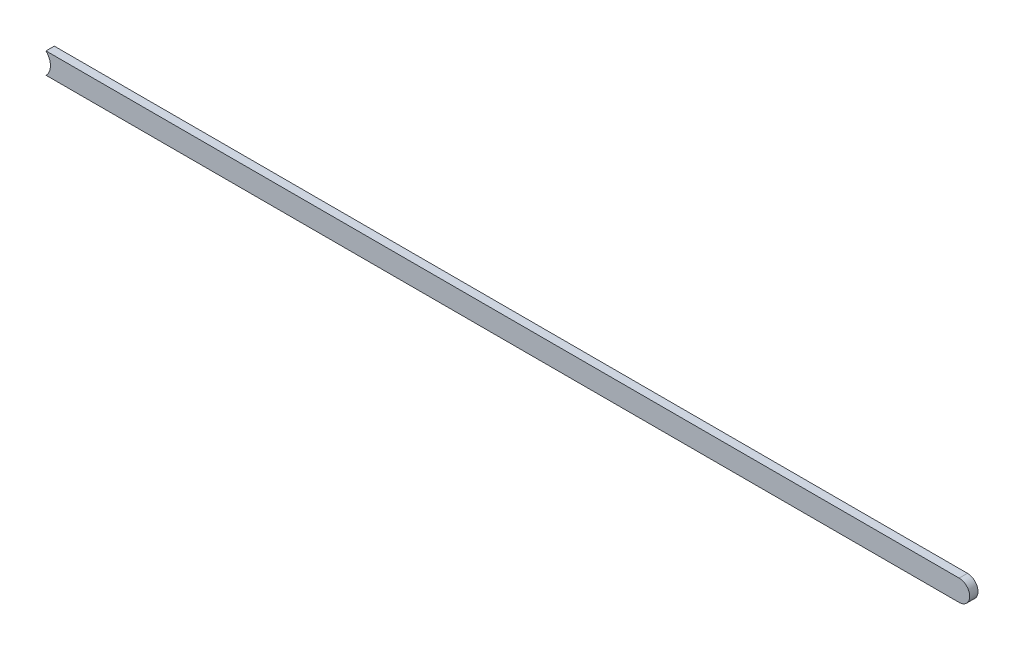
ISO-10303-21;
HEADER;
FILE_DESCRIPTION(('STEP AP214'),'2;1');
FILE_NAME('part.step','',(''),(''),'','','');
FILE_SCHEMA(('AUTOMOTIVE_DESIGN { 1 0 10303 214 1 1 1 1 }'));
ENDSEC;
DATA;
#1=APPLICATION_CONTEXT('core data for automotive mechanical design processes');
#2=APPLICATION_PROTOCOL_DEFINITION('international standard','automotive_design',2000,#1);
#3=PRODUCT_CONTEXT('',#1,'mechanical');
#4=PRODUCT('Part','Part','',(#3));
#5=PRODUCT_RELATED_PRODUCT_CATEGORY('part','',(#4));
#6=PRODUCT_DEFINITION_FORMATION('','',#4);
#7=PRODUCT_DEFINITION_CONTEXT('part definition',#1,'design');
#8=PRODUCT_DEFINITION('design','',#6,#7);
#9=PRODUCT_DEFINITION_SHAPE('','',#8);
#10=(LENGTH_UNIT() NAMED_UNIT(*) SI_UNIT(.MILLI.,.METRE.));
#11=(NAMED_UNIT(*) PLANE_ANGLE_UNIT() SI_UNIT($,.RADIAN.));
#12=(NAMED_UNIT(*) SI_UNIT($,.STERADIAN.) SOLID_ANGLE_UNIT());
#13=UNCERTAINTY_MEASURE_WITH_UNIT(LENGTH_MEASURE(1.E-05),#10,'distance_accuracy_value','');
#14=(GEOMETRIC_REPRESENTATION_CONTEXT(3) GLOBAL_UNCERTAINTY_ASSIGNED_CONTEXT((#13)) GLOBAL_UNIT_ASSIGNED_CONTEXT((#10,
#11,#12)) REPRESENTATION_CONTEXT('',''));
#15=CARTESIAN_POINT('',(0.,0.,0.));
#16=DIRECTION('',(0.,0.,1.));
#17=DIRECTION('',(1.,0.,0.));
#18=AXIS2_PLACEMENT_3D('',#15,#16,#17);
#19=CARTESIAN_POINT('',(92.5778681578668,50.927,0.));
#20=DIRECTION('',(0.,1.,0.));
#21=DIRECTION('',(1.,0.,0.));
#22=AXIS2_PLACEMENT_3D('',#19,#20,#21);
#23=PLANE('',#22);
#24=DIRECTION('',(1.,0.,0.));
#25=VECTOR('',#24,1.);
#26=CARTESIAN_POINT('',(92.329,50.927,0.1999996));
#27=LINE('',#26,#25);
#28=CARTESIAN_POINT('',(92.5778681578668,50.927,0.1999996));
#29=VERTEX_POINT('',#28);
#30=CARTESIAN_POINT('',(114.554,50.927,0.1999996));
#31=VERTEX_POINT('',#30);
#32=EDGE_CURVE('E11',#29,#31,#27,.T.);
#33=ORIENTED_EDGE('',*,*,#32,.F.);
#34=DIRECTION('',(0.,0.,1.));
#35=VECTOR('',#34,1.);
#36=CARTESIAN_POINT('',(92.5778681578668,50.927,0.));
#37=LINE('',#36,#35);
#38=CARTESIAN_POINT('',(92.5778681578668,50.927,0.));
#39=VERTEX_POINT('',#38);
#40=EDGE_CURVE('E24',#39,#29,#37,.T.);
#41=ORIENTED_EDGE('',*,*,#40,.F.);
#42=DIRECTION('',(1.,0.,0.));
#43=VECTOR('',#42,1.);
#44=CARTESIAN_POINT('',(92.329,50.927,0.));
#45=LINE('',#44,#43);
#46=CARTESIAN_POINT('',(114.554,50.927,0.));
#47=VERTEX_POINT('',#46);
#48=EDGE_CURVE('E82',#39,#47,#45,.T.);
#49=ORIENTED_EDGE('',*,*,#48,.T.);
#50=DIRECTION('',(0.,0.,1.));
#51=VECTOR('',#50,1.);
#52=CARTESIAN_POINT('',(114.554,50.927,0.));
#53=LINE('',#52,#51);
#54=EDGE_CURVE('E37',#47,#31,#53,.T.);
#55=ORIENTED_EDGE('',*,*,#54,.T.);
#56=EDGE_LOOP('',(#33,#41,#49,#55));
#57=FACE_BOUND('',#56,.T.);
#58=ADVANCED_FACE('F17',(#57),#23,.F.);
#59=CARTESIAN_POINT('',(114.554,51.181,0.));
#60=DIRECTION('',(0.,0.,-1.));
#61=DIRECTION('',(0.,-1.,0.));
#62=AXIS2_PLACEMENT_3D('',#59,#60,#61);
#63=CYLINDRICAL_SURFACE('',#62,0.253999999999998);
#64=CARTESIAN_POINT('',(114.554,51.181,0.1999996));
#65=DIRECTION('',(0.,0.,1.));
#66=DIRECTION('',(0.,-1.,0.));
#67=AXIS2_PLACEMENT_3D('',#64,#65,#66);
#68=CIRCLE('',#67,0.253999999999998);
#69=CARTESIAN_POINT('',(114.554,51.435,0.1999996));
#70=VERTEX_POINT('',#69);
#71=EDGE_CURVE('E97',#31,#70,#68,.T.);
#72=ORIENTED_EDGE('',*,*,#71,.F.);
#73=ORIENTED_EDGE('',*,*,#54,.F.);
#74=CARTESIAN_POINT('',(114.554,51.181,0.));
#75=DIRECTION('',(0.,0.,1.));
#76=DIRECTION('',(0.,-1.,0.));
#77=AXIS2_PLACEMENT_3D('',#74,#75,#76);
#78=CIRCLE('',#77,0.253999999999998);
#79=CARTESIAN_POINT('',(114.554,51.435,0.));
#80=VERTEX_POINT('',#79);
#81=EDGE_CURVE('E94',#47,#80,#78,.T.);
#82=ORIENTED_EDGE('',*,*,#81,.T.);
#83=DIRECTION('',(0.,0.,1.));
#84=VECTOR('',#83,1.);
#85=CARTESIAN_POINT('',(114.554,51.435,0.));
#86=LINE('',#85,#84);
#87=EDGE_CURVE('E92',#80,#70,#86,.T.);
#88=ORIENTED_EDGE('',*,*,#87,.T.);
#89=EDGE_LOOP('',(#72,#73,#82,#88));
#90=FACE_BOUND('',#89,.T.);
#91=ADVANCED_FACE('F103',(#90),#63,.T.);
#92=CARTESIAN_POINT('',(114.554,51.435,0.));
#93=DIRECTION('',(0.,-1.,0.));
#94=DIRECTION('',(-1.,0.,0.));
#95=AXIS2_PLACEMENT_3D('',#92,#93,#94);
#96=PLANE('',#95);
#97=DIRECTION('',(-1.,0.,0.));
#98=VECTOR('',#97,1.);
#99=CARTESIAN_POINT('',(114.554,51.435,0.1999996));
#100=LINE('',#99,#98);
#101=CARTESIAN_POINT('',(92.5778681578668,51.435,0.1999996));
#102=VERTEX_POINT('',#101);
#103=EDGE_CURVE('E89',#70,#102,#100,.T.);
#104=ORIENTED_EDGE('',*,*,#103,.F.);
#105=ORIENTED_EDGE('',*,*,#87,.F.);
#106=DIRECTION('',(-1.,0.,0.));
#107=VECTOR('',#106,1.);
#108=CARTESIAN_POINT('',(114.554,51.435,0.));
#109=LINE('',#108,#107);
#110=CARTESIAN_POINT('',(92.5778681578668,51.435,0.));
#111=VERTEX_POINT('',#110);
#112=EDGE_CURVE('E87',#80,#111,#109,.T.);
#113=ORIENTED_EDGE('',*,*,#112,.T.);
#114=DIRECTION('',(0.,0.,1.));
#115=VECTOR('',#114,1.);
#116=CARTESIAN_POINT('',(92.5778681578668,51.435,0.));
#117=LINE('',#116,#115);
#118=EDGE_CURVE('E69',#111,#102,#117,.T.);
#119=ORIENTED_EDGE('',*,*,#118,.T.);
#120=EDGE_LOOP('',(#104,#105,#113,#119));
#121=FACE_BOUND('',#120,.T.);
#122=ADVANCED_FACE('F108',(#121),#96,.F.);
#123=CARTESIAN_POINT('',(92.329,51.181,0.));
#124=DIRECTION('',(0.,0.,-1.));
#125=DIRECTION('',(1.,0.,0.));
#126=AXIS2_PLACEMENT_3D('',#123,#124,#125);
#127=CYLINDRICAL_SURFACE('',#126,0.3556);
#128=DIRECTION('',(0.,0.,1.));
#129=VECTOR('',#128,1.);
#130=CARTESIAN_POINT('',(92.6846,51.181,0.));
#131=LINE('',#130,#129);
#132=CARTESIAN_POINT('',(92.6846,51.181,0.));
#133=VERTEX_POINT('',#132);
#134=CARTESIAN_POINT('',(92.6846,51.181,0.1999996));
#135=VERTEX_POINT('',#134);
#136=EDGE_CURVE('E59',#133,#135,#131,.T.);
#137=ORIENTED_EDGE('',*,*,#136,.T.);
#138=CARTESIAN_POINT('',(92.329,51.181,0.1999996));
#139=DIRECTION('',(0.,0.,1.));
#140=DIRECTION('',(1.,0.,0.));
#141=AXIS2_PLACEMENT_3D('',#138,#139,#140);
#142=CIRCLE('',#141,0.3556);
#143=EDGE_CURVE('E70',#135,#102,#142,.T.);
#144=ORIENTED_EDGE('',*,*,#143,.T.);
#145=ORIENTED_EDGE('',*,*,#118,.F.);
#146=CARTESIAN_POINT('',(92.329,51.181,0.));
#147=DIRECTION('',(0.,0.,1.));
#148=DIRECTION('',(1.,0.,0.));
#149=AXIS2_PLACEMENT_3D('',#146,#147,#148);
#150=CIRCLE('',#149,0.3556);
#151=EDGE_CURVE('E73',#133,#111,#150,.T.);
#152=ORIENTED_EDGE('',*,*,#151,.F.);
#153=EDGE_LOOP('',(#137,#144,#145,#152));
#154=FACE_BOUND('',#153,.T.);
#155=ADVANCED_FACE('F74',(#154),#127,.F.);
#156=CARTESIAN_POINT('',(92.329,51.181,0.));
#157=DIRECTION('',(0.,0.,-1.));
#158=DIRECTION('',(1.,0.,0.));
#159=AXIS2_PLACEMENT_3D('',#156,#157,#158);
#160=CYLINDRICAL_SURFACE('',#159,0.3556);
#161=ORIENTED_EDGE('',*,*,#40,.T.);
#162=CARTESIAN_POINT('',(92.329,51.181,0.1999996));
#163=DIRECTION('',(0.,0.,1.));
#164=DIRECTION('',(1.,0.,0.));
#165=AXIS2_PLACEMENT_3D('',#162,#163,#164);
#166=CIRCLE('',#165,0.3556);
#167=EDGE_CURVE('E65',#29,#135,#166,.T.);
#168=ORIENTED_EDGE('',*,*,#167,.T.);
#169=ORIENTED_EDGE('',*,*,#136,.F.);
#170=EDGE_CURVE('E63',#39,#133,#150,.T.);
#171=ORIENTED_EDGE('',*,*,#170,.F.);
#172=EDGE_LOOP('',(#161,#168,#169,#171));
#173=FACE_BOUND('',#172,.T.);
#174=ADVANCED_FACE('F61',(#173),#160,.F.);
#175=CARTESIAN_POINT('',(92.329,50.927,0.));
#176=DIRECTION('',(0.,0.,-1.));
#177=DIRECTION('',(-1.,0.,0.));
#178=AXIS2_PLACEMENT_3D('',#175,#176,#177);
#179=PLANE('',#178);
#180=ORIENTED_EDGE('',*,*,#48,.F.);
#181=ORIENTED_EDGE('',*,*,#170,.T.);
#182=ORIENTED_EDGE('',*,*,#151,.T.);
#183=ORIENTED_EDGE('',*,*,#112,.F.);
#184=ORIENTED_EDGE('',*,*,#81,.F.);
#185=EDGE_LOOP('',(#180,#181,#182,#183,#184));
#186=FACE_BOUND('',#185,.T.);
#187=ADVANCED_FACE('F80',(#186),#179,.T.);
#188=CARTESIAN_POINT('',(92.329,50.927,0.1999996));
#189=DIRECTION('',(0.,0.,-1.));
#190=DIRECTION('',(-1.,0.,0.));
#191=AXIS2_PLACEMENT_3D('',#188,#189,#190);
#192=PLANE('',#191);
#193=ORIENTED_EDGE('',*,*,#167,.F.);
#194=ORIENTED_EDGE('',*,*,#32,.T.);
#195=ORIENTED_EDGE('',*,*,#71,.T.);
#196=ORIENTED_EDGE('',*,*,#103,.T.);
#197=ORIENTED_EDGE('',*,*,#143,.F.);
#198=EDGE_LOOP('',(#193,#194,#195,#196,#197));
#199=FACE_BOUND('',#198,.T.);
#200=ADVANCED_FACE('F106',(#199),#192,.F.);
#201=CLOSED_SHELL('',(#58,#91,#122,#155,#174,#187,#200));
#202=MANIFOLD_SOLID_BREP('B1',#201);
#203=ADVANCED_BREP_SHAPE_REPRESENTATION('',(#18,#202),#14);
#204=SHAPE_DEFINITION_REPRESENTATION(#9,#203);
ENDSEC;
END-ISO-10303-21;
